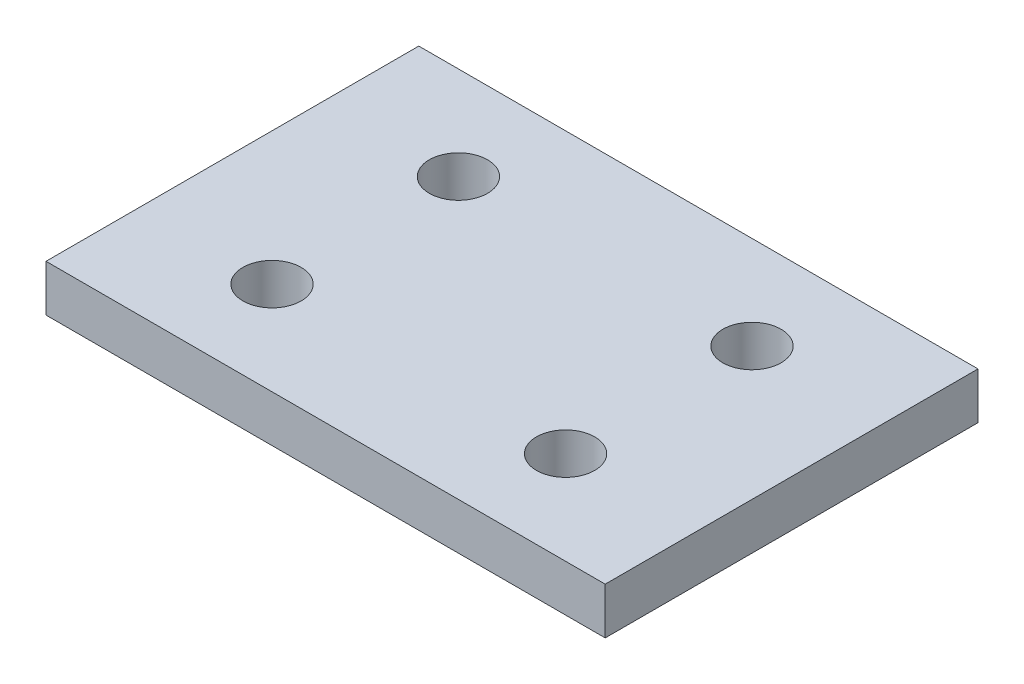
ISO-10303-21;
HEADER;
FILE_DESCRIPTION(('STEP AP214'),'2;1');
FILE_NAME('part.step','',(''),(''),'','','');
FILE_SCHEMA(('AUTOMOTIVE_DESIGN { 1 0 10303 214 1 1 1 1 }'));
ENDSEC;
DATA;
#1=APPLICATION_CONTEXT('core data for automotive mechanical design processes');
#2=APPLICATION_PROTOCOL_DEFINITION('international standard','automotive_design',2000,#1);
#3=PRODUCT_CONTEXT('',#1,'mechanical');
#4=PRODUCT('Part','Part','',(#3));
#5=PRODUCT_RELATED_PRODUCT_CATEGORY('part','',(#4));
#6=PRODUCT_DEFINITION_FORMATION('','',#4);
#7=PRODUCT_DEFINITION_CONTEXT('part definition',#1,'design');
#8=PRODUCT_DEFINITION('design','',#6,#7);
#9=PRODUCT_DEFINITION_SHAPE('','',#8);
#10=(LENGTH_UNIT() NAMED_UNIT(*) SI_UNIT(.MILLI.,.METRE.));
#11=(NAMED_UNIT(*) PLANE_ANGLE_UNIT() SI_UNIT($,.RADIAN.));
#12=(NAMED_UNIT(*) SI_UNIT($,.STERADIAN.) SOLID_ANGLE_UNIT());
#13=UNCERTAINTY_MEASURE_WITH_UNIT(LENGTH_MEASURE(1.E-05),#10,'distance_accuracy_value','');
#14=(GEOMETRIC_REPRESENTATION_CONTEXT(3) GLOBAL_UNCERTAINTY_ASSIGNED_CONTEXT((#13)) GLOBAL_UNIT_ASSIGNED_CONTEXT((#10,
#11,#12)) REPRESENTATION_CONTEXT('',''));
#15=CARTESIAN_POINT('',(0.,0.,0.));
#16=DIRECTION('',(0.,0.,1.));
#17=DIRECTION('',(1.,0.,0.));
#18=AXIS2_PLACEMENT_3D('',#15,#16,#17);
#19=CARTESIAN_POINT('',(0.,6.35,0.));
#20=DIRECTION('',(1.,0.,0.));
#21=DIRECTION('',(0.,0.,-1.));
#22=AXIS2_PLACEMENT_3D('',#19,#20,#21);
#23=PLANE('',#22);
#24=DIRECTION('',(0.,0.,1.));
#25=VECTOR('',#24,1.);
#26=CARTESIAN_POINT('',(0.,0.,0.));
#27=LINE('',#26,#25);
#28=CARTESIAN_POINT('',(0.,0.,-50.8));
#29=VERTEX_POINT('',#28);
#30=CARTESIAN_POINT('',(0.,0.,0.));
#31=VERTEX_POINT('',#30);
#32=EDGE_CURVE('E103',#29,#31,#27,.T.);
#33=ORIENTED_EDGE('',*,*,#32,.T.);
#34=DIRECTION('',(0.,-1.,0.));
#35=VECTOR('',#34,1.);
#36=CARTESIAN_POINT('',(0.,6.35,0.));
#37=LINE('',#36,#35);
#38=CARTESIAN_POINT('',(0.,6.35,0.));
#39=VERTEX_POINT('',#38);
#40=EDGE_CURVE('E11',#39,#31,#37,.T.);
#41=ORIENTED_EDGE('',*,*,#40,.F.);
#42=DIRECTION('',(0.,0.,1.));
#43=VECTOR('',#42,1.);
#44=CARTESIAN_POINT('',(0.,6.35,0.));
#45=LINE('',#44,#43);
#46=CARTESIAN_POINT('',(0.,6.35,-50.8));
#47=VERTEX_POINT('',#46);
#48=EDGE_CURVE('E91',#47,#39,#45,.T.);
#49=ORIENTED_EDGE('',*,*,#48,.F.);
#50=DIRECTION('',(0.,-1.,0.));
#51=VECTOR('',#50,1.);
#52=CARTESIAN_POINT('',(0.,6.35,-50.8));
#53=LINE('',#52,#51);
#54=EDGE_CURVE('E99',#47,#29,#53,.T.);
#55=ORIENTED_EDGE('',*,*,#54,.T.);
#56=EDGE_LOOP('',(#33,#41,#49,#55));
#57=FACE_BOUND('',#56,.T.);
#58=ADVANCED_FACE('F40',(#57),#23,.F.);
#59=CARTESIAN_POINT('',(0.,6.35,0.));
#60=DIRECTION('',(0.,0.,-1.));
#61=DIRECTION('',(-1.,0.,0.));
#62=AXIS2_PLACEMENT_3D('',#59,#60,#61);
#63=PLANE('',#62);
#64=DIRECTION('',(1.,0.,0.));
#65=VECTOR('',#64,1.);
#66=CARTESIAN_POINT('',(0.,0.,0.));
#67=LINE('',#66,#65);
#68=CARTESIAN_POINT('',(76.2,0.,0.));
#69=VERTEX_POINT('',#68);
#70=EDGE_CURVE('E95',#31,#69,#67,.T.);
#71=ORIENTED_EDGE('',*,*,#70,.T.);
#72=DIRECTION('',(0.,-1.,0.));
#73=VECTOR('',#72,1.);
#74=CARTESIAN_POINT('',(76.2,6.35,0.));
#75=LINE('',#74,#73);
#76=CARTESIAN_POINT('',(76.2,6.35,0.));
#77=VERTEX_POINT('',#76);
#78=EDGE_CURVE('E48',#77,#69,#75,.T.);
#79=ORIENTED_EDGE('',*,*,#78,.F.);
#80=DIRECTION('',(1.,0.,0.));
#81=VECTOR('',#80,1.);
#82=CARTESIAN_POINT('',(0.,6.35,0.));
#83=LINE('',#82,#81);
#84=EDGE_CURVE('E86',#39,#77,#83,.T.);
#85=ORIENTED_EDGE('',*,*,#84,.F.);
#86=ORIENTED_EDGE('',*,*,#40,.T.);
#87=EDGE_LOOP('',(#71,#79,#85,#86));
#88=FACE_BOUND('',#87,.T.);
#89=ADVANCED_FACE('F94',(#88),#63,.F.);
#90=CARTESIAN_POINT('',(76.2,6.35,0.));
#91=DIRECTION('',(-1.,0.,0.));
#92=DIRECTION('',(0.,0.,1.));
#93=AXIS2_PLACEMENT_3D('',#90,#91,#92);
#94=PLANE('',#93);
#95=DIRECTION('',(0.,0.,-1.));
#96=VECTOR('',#95,1.);
#97=CARTESIAN_POINT('',(76.2,0.,0.));
#98=LINE('',#97,#96);
#99=CARTESIAN_POINT('',(76.2,0.,-50.8));
#100=VERTEX_POINT('',#99);
#101=EDGE_CURVE('E73',#69,#100,#98,.T.);
#102=ORIENTED_EDGE('',*,*,#101,.T.);
#103=DIRECTION('',(0.,-1.,0.));
#104=VECTOR('',#103,1.);
#105=CARTESIAN_POINT('',(76.2,6.35,-50.8));
#106=LINE('',#105,#104);
#107=CARTESIAN_POINT('',(76.2,6.35,-50.8));
#108=VERTEX_POINT('',#107);
#109=EDGE_CURVE('E96',#108,#100,#106,.T.);
#110=ORIENTED_EDGE('',*,*,#109,.F.);
#111=DIRECTION('',(0.,0.,-1.));
#112=VECTOR('',#111,1.);
#113=CARTESIAN_POINT('',(76.2,6.35,0.));
#114=LINE('',#113,#112);
#115=EDGE_CURVE('E89',#77,#108,#114,.T.);
#116=ORIENTED_EDGE('',*,*,#115,.F.);
#117=ORIENTED_EDGE('',*,*,#78,.T.);
#118=EDGE_LOOP('',(#102,#110,#116,#117));
#119=FACE_BOUND('',#118,.T.);
#120=ADVANCED_FACE('F97',(#119),#94,.F.);
#121=CARTESIAN_POINT('',(0.,6.35,-50.8));
#122=DIRECTION('',(0.,0.,1.));
#123=DIRECTION('',(1.,0.,0.));
#124=AXIS2_PLACEMENT_3D('',#121,#122,#123);
#125=PLANE('',#124);
#126=DIRECTION('',(-1.,0.,0.));
#127=VECTOR('',#126,1.);
#128=CARTESIAN_POINT('',(0.,0.,-50.8));
#129=LINE('',#128,#127);
#130=EDGE_CURVE('E79',#100,#29,#129,.T.);
#131=ORIENTED_EDGE('',*,*,#130,.T.);
#132=ORIENTED_EDGE('',*,*,#54,.F.);
#133=DIRECTION('',(-1.,0.,0.));
#134=VECTOR('',#133,1.);
#135=CARTESIAN_POINT('',(0.,6.35,-50.8));
#136=LINE('',#135,#134);
#137=EDGE_CURVE('E56',#108,#47,#136,.T.);
#138=ORIENTED_EDGE('',*,*,#137,.F.);
#139=ORIENTED_EDGE('',*,*,#109,.T.);
#140=EDGE_LOOP('',(#131,#132,#138,#139));
#141=FACE_BOUND('',#140,.T.);
#142=ADVANCED_FACE('F111',(#141),#125,.F.);
#143=CARTESIAN_POINT('',(0.,6.35,0.));
#144=DIRECTION('',(0.,-1.,0.));
#145=DIRECTION('',(0.,0.,-1.));
#146=AXIS2_PLACEMENT_3D('',#143,#144,#145);
#147=PLANE('',#146);
#148=CARTESIAN_POINT('',(18.1,6.35,-12.7));
#149=DIRECTION('',(0.,1.,0.));
#150=DIRECTION('',(0.,0.,1.));
#151=AXIS2_PLACEMENT_3D('',#148,#149,#150);
#152=CIRCLE('',#151,3.96875);
#153=CARTESIAN_POINT('',(18.1,6.35,-8.73125));
#154=VERTEX_POINT('',#153);
#155=EDGE_CURVE('E120',#154,#154,#152,.T.);
#156=ORIENTED_EDGE('',*,*,#155,.F.);
#157=EDGE_LOOP('',(#156));
#158=FACE_BOUND('',#157,.T.);
#159=CARTESIAN_POINT('',(58.1,6.35,-38.1));
#160=DIRECTION('',(0.,1.,0.));
#161=DIRECTION('',(0.,0.,1.));
#162=AXIS2_PLACEMENT_3D('',#159,#160,#161);
#163=CIRCLE('',#162,3.96875);
#164=CARTESIAN_POINT('',(58.1,6.35,-34.13125));
#165=VERTEX_POINT('',#164);
#166=EDGE_CURVE('E126',#165,#165,#163,.T.);
#167=ORIENTED_EDGE('',*,*,#166,.F.);
#168=EDGE_LOOP('',(#167));
#169=FACE_BOUND('',#168,.T.);
#170=CARTESIAN_POINT('',(58.1,6.35,-12.7));
#171=DIRECTION('',(0.,1.,0.));
#172=DIRECTION('',(0.,0.,1.));
#173=AXIS2_PLACEMENT_3D('',#170,#171,#172);
#174=CIRCLE('',#173,3.96875);
#175=CARTESIAN_POINT('',(58.1,6.35,-8.73125));
#176=VERTEX_POINT('',#175);
#177=EDGE_CURVE('E127',#176,#176,#174,.T.);
#178=ORIENTED_EDGE('',*,*,#177,.F.);
#179=EDGE_LOOP('',(#178));
#180=FACE_BOUND('',#179,.T.);
#181=CARTESIAN_POINT('',(18.1,6.35,-38.1));
#182=DIRECTION('',(0.,1.,0.));
#183=DIRECTION('',(0.,0.,1.));
#184=AXIS2_PLACEMENT_3D('',#181,#182,#183);
#185=CIRCLE('',#184,3.96875);
#186=CARTESIAN_POINT('',(18.1,6.35,-34.13125));
#187=VERTEX_POINT('',#186);
#188=EDGE_CURVE('E117',#187,#187,#185,.T.);
#189=ORIENTED_EDGE('',*,*,#188,.F.);
#190=EDGE_LOOP('',(#189));
#191=FACE_BOUND('',#190,.T.);
#192=ORIENTED_EDGE('',*,*,#48,.T.);
#193=ORIENTED_EDGE('',*,*,#84,.T.);
#194=ORIENTED_EDGE('',*,*,#115,.T.);
#195=ORIENTED_EDGE('',*,*,#137,.T.);
#196=EDGE_LOOP('',(#192,#193,#194,#195));
#197=FACE_BOUND('',#196,.T.);
#198=ADVANCED_FACE('F87',(#158,#169,#180,#191,#197),#147,.F.);
#199=CARTESIAN_POINT('',(0.,0.,0.));
#200=DIRECTION('',(0.,-1.,0.));
#201=DIRECTION('',(0.,0.,-1.));
#202=AXIS2_PLACEMENT_3D('',#199,#200,#201);
#203=PLANE('',#202);
#204=CARTESIAN_POINT('',(18.1,0.,-12.7));
#205=DIRECTION('',(0.,1.,0.));
#206=DIRECTION('',(0.,0.,1.));
#207=AXIS2_PLACEMENT_3D('',#204,#205,#206);
#208=CIRCLE('',#207,3.96875);
#209=CARTESIAN_POINT('',(18.1,0.,-8.73125));
#210=VERTEX_POINT('',#209);
#211=EDGE_CURVE('E130',#210,#210,#208,.T.);
#212=ORIENTED_EDGE('',*,*,#211,.T.);
#213=EDGE_LOOP('',(#212));
#214=FACE_BOUND('',#213,.T.);
#215=CARTESIAN_POINT('',(58.1,0.,-38.1));
#216=DIRECTION('',(0.,1.,0.));
#217=DIRECTION('',(0.,0.,1.));
#218=AXIS2_PLACEMENT_3D('',#215,#216,#217);
#219=CIRCLE('',#218,3.96875);
#220=CARTESIAN_POINT('',(58.1,0.,-34.13125));
#221=VERTEX_POINT('',#220);
#222=EDGE_CURVE('E123',#221,#221,#219,.T.);
#223=ORIENTED_EDGE('',*,*,#222,.T.);
#224=EDGE_LOOP('',(#223));
#225=FACE_BOUND('',#224,.T.);
#226=CARTESIAN_POINT('',(58.1,0.,-12.7));
#227=DIRECTION('',(0.,1.,0.));
#228=DIRECTION('',(0.,0.,1.));
#229=AXIS2_PLACEMENT_3D('',#226,#227,#228);
#230=CIRCLE('',#229,3.96875);
#231=CARTESIAN_POINT('',(58.1,0.,-8.73125));
#232=VERTEX_POINT('',#231);
#233=EDGE_CURVE('E135',#232,#232,#230,.T.);
#234=ORIENTED_EDGE('',*,*,#233,.T.);
#235=EDGE_LOOP('',(#234));
#236=FACE_BOUND('',#235,.T.);
#237=CARTESIAN_POINT('',(18.1,0.,-38.1));
#238=DIRECTION('',(0.,1.,0.));
#239=DIRECTION('',(0.,0.,1.));
#240=AXIS2_PLACEMENT_3D('',#237,#238,#239);
#241=CIRCLE('',#240,3.96875);
#242=CARTESIAN_POINT('',(18.1,0.,-34.13125));
#243=VERTEX_POINT('',#242);
#244=EDGE_CURVE('E106',#243,#243,#241,.T.);
#245=ORIENTED_EDGE('',*,*,#244,.T.);
#246=EDGE_LOOP('',(#245));
#247=FACE_BOUND('',#246,.T.);
#248=ORIENTED_EDGE('',*,*,#32,.F.);
#249=ORIENTED_EDGE('',*,*,#130,.F.);
#250=ORIENTED_EDGE('',*,*,#101,.F.);
#251=ORIENTED_EDGE('',*,*,#70,.F.);
#252=EDGE_LOOP('',(#248,#249,#250,#251));
#253=FACE_BOUND('',#252,.T.);
#254=ADVANCED_FACE('F114',(#214,#225,#236,#247,#253),#203,.T.);
#255=CARTESIAN_POINT('',(18.1,0.,-38.1));
#256=DIRECTION('',(0.,1.,0.));
#257=DIRECTION('',(0.,0.,1.));
#258=AXIS2_PLACEMENT_3D('',#255,#256,#257);
#259=CYLINDRICAL_SURFACE('',#258,3.96875);
#260=ORIENTED_EDGE('',*,*,#244,.F.);
#261=EDGE_LOOP('',(#260));
#262=FACE_BOUND('',#261,.T.);
#263=ORIENTED_EDGE('',*,*,#188,.T.);
#264=EDGE_LOOP('',(#263));
#265=FACE_BOUND('',#264,.T.);
#266=ADVANCED_FACE('F149',(#262,#265),#259,.F.);
#267=CARTESIAN_POINT('',(58.1,0.,-12.7));
#268=DIRECTION('',(0.,1.,0.));
#269=DIRECTION('',(0.,0.,1.));
#270=AXIS2_PLACEMENT_3D('',#267,#268,#269);
#271=CYLINDRICAL_SURFACE('',#270,3.96875);
#272=ORIENTED_EDGE('',*,*,#233,.F.);
#273=EDGE_LOOP('',(#272));
#274=FACE_BOUND('',#273,.T.);
#275=ORIENTED_EDGE('',*,*,#177,.T.);
#276=EDGE_LOOP('',(#275));
#277=FACE_BOUND('',#276,.T.);
#278=ADVANCED_FACE('F141',(#274,#277),#271,.F.);
#279=CARTESIAN_POINT('',(58.1,0.,-38.1));
#280=DIRECTION('',(0.,1.,0.));
#281=DIRECTION('',(0.,0.,1.));
#282=AXIS2_PLACEMENT_3D('',#279,#280,#281);
#283=CYLINDRICAL_SURFACE('',#282,3.96875);
#284=ORIENTED_EDGE('',*,*,#222,.F.);
#285=EDGE_LOOP('',(#284));
#286=FACE_BOUND('',#285,.T.);
#287=ORIENTED_EDGE('',*,*,#166,.T.);
#288=EDGE_LOOP('',(#287));
#289=FACE_BOUND('',#288,.T.);
#290=ADVANCED_FACE('F157',(#286,#289),#283,.F.);
#291=CARTESIAN_POINT('',(18.1,0.,-12.7));
#292=DIRECTION('',(0.,1.,0.));
#293=DIRECTION('',(0.,0.,1.));
#294=AXIS2_PLACEMENT_3D('',#291,#292,#293);
#295=CYLINDRICAL_SURFACE('',#294,3.96875);
#296=ORIENTED_EDGE('',*,*,#211,.F.);
#297=EDGE_LOOP('',(#296));
#298=FACE_BOUND('',#297,.T.);
#299=ORIENTED_EDGE('',*,*,#155,.T.);
#300=EDGE_LOOP('',(#299));
#301=FACE_BOUND('',#300,.T.);
#302=ADVANCED_FACE('F208',(#298,#301),#295,.F.);
#303=CLOSED_SHELL('',(#58,#89,#120,#142,#198,#254,#266,#278,#290,#302));
#304=MANIFOLD_SOLID_BREP('B2',#303);
#305=ADVANCED_BREP_SHAPE_REPRESENTATION('',(#18,#304),#14);
#306=SHAPE_DEFINITION_REPRESENTATION(#9,#305);
ENDSEC;
END-ISO-10303-21;
